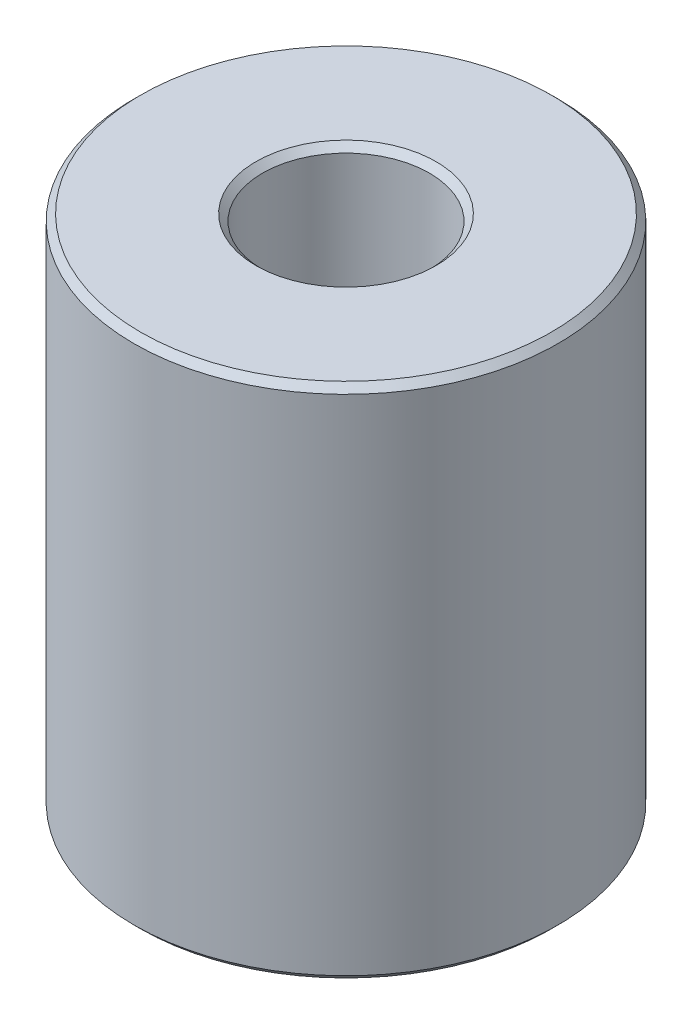
ISO-10303-21;
HEADER;
FILE_DESCRIPTION(('STEP AP214'),'2;1');
FILE_NAME('part.step','',(''),(''),'','','');
FILE_SCHEMA(('AUTOMOTIVE_DESIGN { 1 0 10303 214 1 1 1 1 }'));
ENDSEC;
DATA;
#1=APPLICATION_CONTEXT('core data for automotive mechanical design processes');
#2=APPLICATION_PROTOCOL_DEFINITION('international standard','automotive_design',2000,#1);
#3=PRODUCT_CONTEXT('',#1,'mechanical');
#4=PRODUCT('Part','Part','',(#3));
#5=PRODUCT_RELATED_PRODUCT_CATEGORY('part','',(#4));
#6=PRODUCT_DEFINITION_FORMATION('','',#4);
#7=PRODUCT_DEFINITION_CONTEXT('part definition',#1,'design');
#8=PRODUCT_DEFINITION('design','',#6,#7);
#9=PRODUCT_DEFINITION_SHAPE('','',#8);
#10=(LENGTH_UNIT() NAMED_UNIT(*) SI_UNIT(.MILLI.,.METRE.));
#11=(NAMED_UNIT(*) PLANE_ANGLE_UNIT() SI_UNIT($,.RADIAN.));
#12=(NAMED_UNIT(*) SI_UNIT($,.STERADIAN.) SOLID_ANGLE_UNIT());
#13=UNCERTAINTY_MEASURE_WITH_UNIT(LENGTH_MEASURE(1.E-05),#10,'distance_accuracy_value','');
#14=(GEOMETRIC_REPRESENTATION_CONTEXT(3) GLOBAL_UNCERTAINTY_ASSIGNED_CONTEXT((#13)) GLOBAL_UNIT_ASSIGNED_CONTEXT((#10,
#11,#12)) REPRESENTATION_CONTEXT('',''));
#15=CARTESIAN_POINT('',(0.,0.,0.));
#16=DIRECTION('',(0.,0.,1.));
#17=DIRECTION('',(1.,0.,0.));
#18=AXIS2_PLACEMENT_3D('',#15,#16,#17);
#19=CARTESIAN_POINT('',(15.5,0.,0.));
#20=DIRECTION('',(0.,-1.,0.));
#21=DIRECTION('',(0.,0.,-1.));
#22=AXIS2_PLACEMENT_3D('',#19,#20,#21);
#23=PLANE('',#22);
#24=CARTESIAN_POINT('',(0.,0.,0.));
#25=DIRECTION('',(0.,1.,0.));
#26=DIRECTION('',(0.,0.,1.));
#27=AXIS2_PLACEMENT_3D('',#24,#25,#26);
#28=CIRCLE('',#27,6.79999999999613);
#29=CARTESIAN_POINT('',(0.,0.,6.79999999999613));
#30=VERTEX_POINT('',#29);
#31=EDGE_CURVE('E10',#30,#30,#28,.T.);
#32=ORIENTED_EDGE('',*,*,#31,.T.);
#33=EDGE_LOOP('',(#32));
#34=FACE_BOUND('',#33,.T.);
#35=CARTESIAN_POINT('',(0.,0.,0.));
#36=DIRECTION('',(0.,1.,0.));
#37=DIRECTION('',(0.,0.,1.));
#38=AXIS2_PLACEMENT_3D('',#35,#36,#37);
#39=CIRCLE('',#38,15.5);
#40=CARTESIAN_POINT('',(0.,0.,15.5));
#41=VERTEX_POINT('',#40);
#42=EDGE_CURVE('E59',#41,#41,#39,.T.);
#43=ORIENTED_EDGE('',*,*,#42,.F.);
#44=EDGE_LOOP('',(#43));
#45=FACE_BOUND('',#44,.T.);
#46=ADVANCED_FACE('F31',(#34,#45),#23,.T.);
#47=CARTESIAN_POINT('',(0.,0.,0.));
#48=DIRECTION('',(0.,-1.,0.));
#49=DIRECTION('',(0.,0.,-1.));
#50=AXIS2_PLACEMENT_3D('',#47,#48,#49);
#51=CONICAL_SURFACE('',#50,6.79999999999613,0.785398163397448);
#52=CARTESIAN_POINT('',(0.,0.500000000045069,0.));
#53=DIRECTION('',(0.,1.,0.));
#54=DIRECTION('',(0.,0.,1.));
#55=AXIS2_PLACEMENT_3D('',#52,#53,#54);
#56=CIRCLE('',#55,6.29999999995111);
#57=CARTESIAN_POINT('',(0.,0.500000000045069,6.29999999995111));
#58=VERTEX_POINT('',#57);
#59=EDGE_CURVE('E37',#58,#58,#56,.T.);
#60=ORIENTED_EDGE('',*,*,#59,.T.);
#61=EDGE_LOOP('',(#60));
#62=FACE_BOUND('',#61,.T.);
#63=ORIENTED_EDGE('',*,*,#31,.F.);
#64=EDGE_LOOP('',(#63));
#65=FACE_BOUND('',#64,.T.);
#66=ADVANCED_FACE('F67',(#62,#65),#51,.F.);
#67=CARTESIAN_POINT('',(0.,-2.18748630320675E-12,0.));
#68=DIRECTION('',(0.,1.,0.));
#69=DIRECTION('',(0.,0.,1.));
#70=AXIS2_PLACEMENT_3D('',#67,#68,#69);
#71=CYLINDRICAL_SURFACE('',#70,6.29999999995111);
#72=CARTESIAN_POINT('',(0.,38.4999999999991,0.));
#73=DIRECTION('',(0.,1.,0.));
#74=DIRECTION('',(0.,0.,1.));
#75=AXIS2_PLACEMENT_3D('',#72,#73,#74);
#76=CIRCLE('',#75,6.29999999995111);
#77=CARTESIAN_POINT('',(0.,38.4999999999991,6.29999999995111));
#78=VERTEX_POINT('',#77);
#79=EDGE_CURVE('E41',#78,#78,#76,.T.);
#80=ORIENTED_EDGE('',*,*,#79,.T.);
#81=EDGE_LOOP('',(#80));
#82=FACE_BOUND('',#81,.T.);
#83=ORIENTED_EDGE('',*,*,#59,.F.);
#84=EDGE_LOOP('',(#83));
#85=FACE_BOUND('',#84,.T.);
#86=ADVANCED_FACE('F71',(#82,#85),#71,.F.);
#87=CARTESIAN_POINT('',(0.,38.4999999999991,0.));
#88=DIRECTION('',(0.,1.,0.));
#89=DIRECTION('',(0.,0.,1.));
#90=AXIS2_PLACEMENT_3D('',#87,#88,#89);
#91=CONICAL_SURFACE('',#90,6.29999999995111,0.785398163443837);
#92=CARTESIAN_POINT('',(0.,39.,0.));
#93=DIRECTION('',(0.,1.,0.));
#94=DIRECTION('',(0.,0.,1.));
#95=AXIS2_PLACEMENT_3D('',#92,#93,#94);
#96=CIRCLE('',#95,6.79999999999836);
#97=CARTESIAN_POINT('',(0.,39.,6.79999999999836));
#98=VERTEX_POINT('',#97);
#99=EDGE_CURVE('E45',#98,#98,#96,.T.);
#100=ORIENTED_EDGE('',*,*,#99,.T.);
#101=EDGE_LOOP('',(#100));
#102=FACE_BOUND('',#101,.T.);
#103=ORIENTED_EDGE('',*,*,#79,.F.);
#104=EDGE_LOOP('',(#103));
#105=FACE_BOUND('',#104,.T.);
#106=ADVANCED_FACE('F75',(#102,#105),#91,.F.);
#107=CARTESIAN_POINT('',(6.79999999999836,39.,0.));
#108=DIRECTION('',(0.,1.,0.));
#109=DIRECTION('',(0.,0.,1.));
#110=AXIS2_PLACEMENT_3D('',#107,#108,#109);
#111=PLANE('',#110);
#112=CARTESIAN_POINT('',(0.,39.,0.));
#113=DIRECTION('',(0.,1.,0.));
#114=DIRECTION('',(0.,0.,1.));
#115=AXIS2_PLACEMENT_3D('',#112,#113,#114);
#116=CIRCLE('',#115,15.5);
#117=CARTESIAN_POINT('',(0.,39.,15.5));
#118=VERTEX_POINT('',#117);
#119=EDGE_CURVE('E50',#118,#118,#116,.T.);
#120=ORIENTED_EDGE('',*,*,#119,.T.);
#121=EDGE_LOOP('',(#120));
#122=FACE_BOUND('',#121,.T.);
#123=ORIENTED_EDGE('',*,*,#99,.F.);
#124=EDGE_LOOP('',(#123));
#125=FACE_BOUND('',#124,.T.);
#126=ADVANCED_FACE('F82',(#122,#125),#111,.T.);
#127=CARTESIAN_POINT('',(0.,39.,0.));
#128=DIRECTION('',(0.,-1.,0.));
#129=DIRECTION('',(0.,0.,-1.));
#130=AXIS2_PLACEMENT_3D('',#127,#128,#129);
#131=CONICAL_SURFACE('',#130,15.5,0.785398163397374);
#132=CARTESIAN_POINT('',(0.,38.5,0.));
#133=DIRECTION('',(0.,1.,0.));
#134=DIRECTION('',(0.,0.,1.));
#135=AXIS2_PLACEMENT_3D('',#132,#133,#134);
#136=CIRCLE('',#135,16.);
#137=CARTESIAN_POINT('',(0.,38.5,16.));
#138=VERTEX_POINT('',#137);
#139=EDGE_CURVE('E53',#138,#138,#136,.T.);
#140=ORIENTED_EDGE('',*,*,#139,.T.);
#141=EDGE_LOOP('',(#140));
#142=FACE_BOUND('',#141,.T.);
#143=ORIENTED_EDGE('',*,*,#119,.F.);
#144=EDGE_LOOP('',(#143));
#145=FACE_BOUND('',#144,.T.);
#146=ADVANCED_FACE('F86',(#142,#145),#131,.T.);
#147=CARTESIAN_POINT('',(0.,-2.18748630320675E-12,0.));
#148=DIRECTION('',(0.,1.,0.));
#149=DIRECTION('',(0.,0.,1.));
#150=AXIS2_PLACEMENT_3D('',#147,#148,#149);
#151=CYLINDRICAL_SURFACE('',#150,16.);
#152=CARTESIAN_POINT('',(0.,0.5,0.));
#153=DIRECTION('',(0.,1.,0.));
#154=DIRECTION('',(0.,0.,1.));
#155=AXIS2_PLACEMENT_3D('',#152,#153,#154);
#156=CIRCLE('',#155,16.);
#157=CARTESIAN_POINT('',(0.,0.5,16.));
#158=VERTEX_POINT('',#157);
#159=EDGE_CURVE('E56',#158,#158,#156,.T.);
#160=ORIENTED_EDGE('',*,*,#159,.T.);
#161=EDGE_LOOP('',(#160));
#162=FACE_BOUND('',#161,.T.);
#163=ORIENTED_EDGE('',*,*,#139,.F.);
#164=EDGE_LOOP('',(#163));
#165=FACE_BOUND('',#164,.T.);
#166=ADVANCED_FACE('F90',(#162,#165),#151,.T.);
#167=CARTESIAN_POINT('',(0.,0.5,0.));
#168=DIRECTION('',(0.,1.,0.));
#169=DIRECTION('',(0.,0.,1.));
#170=AXIS2_PLACEMENT_3D('',#167,#168,#169);
#171=CONICAL_SURFACE('',#170,16.,0.785398163397448);
#172=ORIENTED_EDGE('',*,*,#42,.T.);
#173=EDGE_LOOP('',(#172));
#174=FACE_BOUND('',#173,.T.);
#175=ORIENTED_EDGE('',*,*,#159,.F.);
#176=EDGE_LOOP('',(#175));
#177=FACE_BOUND('',#176,.T.);
#178=ADVANCED_FACE('F63',(#174,#177),#171,.T.);
#179=CLOSED_SHELL('',(#46,#66,#86,#106,#126,#146,#166,#178));
#180=MANIFOLD_SOLID_BREP('B2',#179);
#181=ADVANCED_BREP_SHAPE_REPRESENTATION('',(#18,#180),#14);
#182=SHAPE_DEFINITION_REPRESENTATION(#9,#181);
ENDSEC;
END-ISO-10303-21;
